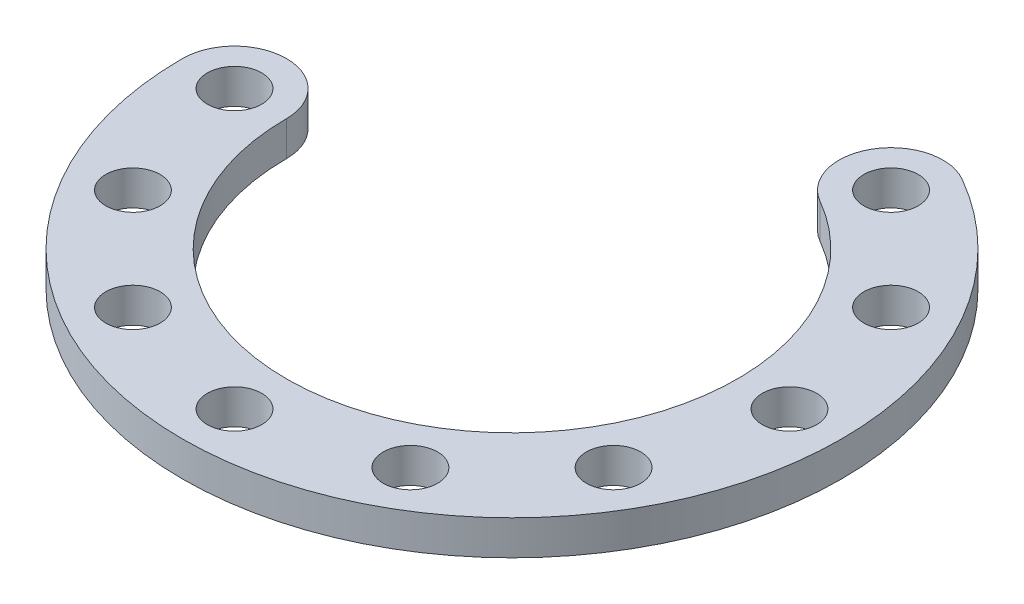
ISO-10303-21;
HEADER;
FILE_DESCRIPTION(('STEP AP214'),'2;1');
FILE_NAME('part.step','',(''),(''),'','','');
FILE_SCHEMA(('AUTOMOTIVE_DESIGN { 1 0 10303 214 1 1 1 1 }'));
ENDSEC;
DATA;
#1=APPLICATION_CONTEXT('core data for automotive mechanical design processes');
#2=APPLICATION_PROTOCOL_DEFINITION('international standard','automotive_design',2000,#1);
#3=PRODUCT_CONTEXT('',#1,'mechanical');
#4=PRODUCT('Part','Part','',(#3));
#5=PRODUCT_RELATED_PRODUCT_CATEGORY('part','',(#4));
#6=PRODUCT_DEFINITION_FORMATION('','',#4);
#7=PRODUCT_DEFINITION_CONTEXT('part definition',#1,'design');
#8=PRODUCT_DEFINITION('design','',#6,#7);
#9=PRODUCT_DEFINITION_SHAPE('','',#8);
#10=(LENGTH_UNIT() NAMED_UNIT(*) SI_UNIT(.MILLI.,.METRE.));
#11=(NAMED_UNIT(*) PLANE_ANGLE_UNIT() SI_UNIT($,.RADIAN.));
#12=(NAMED_UNIT(*) SI_UNIT($,.STERADIAN.) SOLID_ANGLE_UNIT());
#13=UNCERTAINTY_MEASURE_WITH_UNIT(LENGTH_MEASURE(1.E-05),#10,'distance_accuracy_value','');
#14=(GEOMETRIC_REPRESENTATION_CONTEXT(3) GLOBAL_UNCERTAINTY_ASSIGNED_CONTEXT((#13)) GLOBAL_UNIT_ASSIGNED_CONTEXT((#10,
#11,#12)) REPRESENTATION_CONTEXT('',''));
#15=CARTESIAN_POINT('',(0.,0.,0.));
#16=DIRECTION('',(0.,0.,1.));
#17=DIRECTION('',(1.,0.,0.));
#18=AXIS2_PLACEMENT_3D('',#15,#16,#17);
#19=CARTESIAN_POINT('',(-12.7,3.175,0.));
#20=DIRECTION('',(0.,1.,0.));
#21=DIRECTION('',(0.,0.,1.));
#22=AXIS2_PLACEMENT_3D('',#19,#20,#21);
#23=PLANE('',#22);
#24=CARTESIAN_POINT('',(12.7,3.175,-21.9970452561248));
#25=DIRECTION('',(0.,1.,0.));
#26=DIRECTION('',(0.,0.,1.));
#27=AXIS2_PLACEMENT_3D('',#24,#25,#26);
#28=CIRCLE('',#27,2.48920000002373);
#29=CARTESIAN_POINT('',(12.7,3.175,-19.507845256101));
#30=VERTEX_POINT('',#29);
#31=EDGE_CURVE('E186',#30,#30,#28,.T.);
#32=ORIENTED_EDGE('',*,*,#31,.F.);
#33=EDGE_LOOP('',(#32));
#34=FACE_BOUND('',#33,.T.);
#35=CARTESIAN_POINT('',(-21.9970452561247,3.175,12.7));
#36=DIRECTION('',(0.,1.,0.));
#37=DIRECTION('',(0.,0.,1.));
#38=AXIS2_PLACEMENT_3D('',#35,#36,#37);
#39=CIRCLE('',#38,2.48920000000163);
#40=CARTESIAN_POINT('',(-21.9970452561247,3.175,15.1892000000016));
#41=VERTEX_POINT('',#40);
#42=EDGE_CURVE('E170',#41,#41,#39,.T.);
#43=ORIENTED_EDGE('',*,*,#42,.F.);
#44=EDGE_LOOP('',(#43));
#45=FACE_BOUND('',#44,.T.);
#46=CARTESIAN_POINT('',(0.,3.175,25.4));
#47=DIRECTION('',(0.,1.,0.));
#48=DIRECTION('',(0.,0.,1.));
#49=AXIS2_PLACEMENT_3D('',#46,#47,#48);
#50=CIRCLE('',#49,2.48919999998384);
#51=CARTESIAN_POINT('',(0.,3.175,27.8891999999838));
#52=VERTEX_POINT('',#51);
#53=EDGE_CURVE('E154',#52,#52,#50,.T.);
#54=ORIENTED_EDGE('',*,*,#53,.F.);
#55=EDGE_LOOP('',(#54));
#56=FACE_BOUND('',#55,.T.);
#57=CARTESIAN_POINT('',(21.9970452561247,3.175,12.7));
#58=DIRECTION('',(0.,1.,0.));
#59=DIRECTION('',(0.,0.,1.));
#60=AXIS2_PLACEMENT_3D('',#57,#58,#59);
#61=CIRCLE('',#60,2.48919999998932);
#62=CARTESIAN_POINT('',(21.9970452561247,3.175,15.1891999999893));
#63=VERTEX_POINT('',#62);
#64=EDGE_CURVE('E138',#63,#63,#61,.T.);
#65=ORIENTED_EDGE('',*,*,#64,.F.);
#66=EDGE_LOOP('',(#65));
#67=FACE_BOUND('',#66,.T.);
#68=CARTESIAN_POINT('',(-25.4,3.175,0.));
#69=DIRECTION('',(0.,1.,0.));
#70=DIRECTION('',(0.,0.,1.));
#71=AXIS2_PLACEMENT_3D('',#68,#69,#70);
#72=CIRCLE('',#71,4.7625);
#73=CARTESIAN_POINT('',(-20.6375,3.175,0.));
#74=VERTEX_POINT('',#73);
#75=CARTESIAN_POINT('',(-30.1625,3.175,0.));
#76=VERTEX_POINT('',#75);
#77=EDGE_CURVE('E96',#74,#76,#72,.T.);
#78=ORIENTED_EDGE('',*,*,#77,.T.);
#79=CARTESIAN_POINT('',(0.,3.175,0.));
#80=DIRECTION('',(0.,1.,0.));
#81=DIRECTION('',(0.,0.,1.));
#82=AXIS2_PLACEMENT_3D('',#79,#80,#81);
#83=CIRCLE('',#82,30.1625);
#84=CARTESIAN_POINT('',(15.08125,3.175,-26.1214912416481));
#85=VERTEX_POINT('',#84);
#86=EDGE_CURVE('E91',#76,#85,#83,.T.);
#87=ORIENTED_EDGE('',*,*,#86,.T.);
#88=CARTESIAN_POINT('',(12.7,3.175,-21.9970452561248));
#89=DIRECTION('',(0.,1.,0.));
#90=DIRECTION('',(0.,0.,1.));
#91=AXIS2_PLACEMENT_3D('',#88,#89,#90);
#92=CIRCLE('',#91,4.7625);
#93=CARTESIAN_POINT('',(10.31875,3.175,-17.8725992706014));
#94=VERTEX_POINT('',#93);
#95=EDGE_CURVE('E94',#85,#94,#92,.T.);
#96=ORIENTED_EDGE('',*,*,#95,.T.);
#97=CARTESIAN_POINT('',(0.,3.175,0.));
#98=DIRECTION('',(0.,-1.,0.));
#99=DIRECTION('',(0.,0.,1.));
#100=AXIS2_PLACEMENT_3D('',#97,#98,#99);
#101=CIRCLE('',#100,20.6375);
#102=EDGE_CURVE('E61',#94,#74,#101,.T.);
#103=ORIENTED_EDGE('',*,*,#102,.T.);
#104=EDGE_LOOP('',(#78,#87,#96,#103));
#105=FACE_BOUND('',#104,.T.);
#106=CARTESIAN_POINT('',(25.4,3.175,0.));
#107=DIRECTION('',(0.,1.,0.));
#108=DIRECTION('',(0.,0.,1.));
#109=AXIS2_PLACEMENT_3D('',#106,#107,#108);
#110=CIRCLE('',#109,2.4892);
#111=CARTESIAN_POINT('',(25.4,3.175,2.4892));
#112=VERTEX_POINT('',#111);
#113=EDGE_CURVE('E116',#112,#112,#110,.T.);
#114=ORIENTED_EDGE('',*,*,#113,.F.);
#115=EDGE_LOOP('',(#114));
#116=FACE_BOUND('',#115,.T.);
#117=CARTESIAN_POINT('',(12.7,3.175,21.9970452561247));
#118=DIRECTION('',(0.,1.,0.));
#119=DIRECTION('',(0.,0.,1.));
#120=AXIS2_PLACEMENT_3D('',#117,#118,#119);
#121=CIRCLE('',#120,2.4891999999834);
#122=CARTESIAN_POINT('',(12.7,3.175,24.4862452561081));
#123=VERTEX_POINT('',#122);
#124=EDGE_CURVE('E146',#123,#123,#121,.T.);
#125=ORIENTED_EDGE('',*,*,#124,.F.);
#126=EDGE_LOOP('',(#125));
#127=FACE_BOUND('',#126,.T.);
#128=CARTESIAN_POINT('',(-12.7,3.175,21.9970452561247));
#129=DIRECTION('',(0.,1.,0.));
#130=DIRECTION('',(0.,0.,1.));
#131=AXIS2_PLACEMENT_3D('',#128,#129,#130);
#132=CIRCLE('',#131,2.48919999999052);
#133=CARTESIAN_POINT('',(-12.7,3.175,24.4862452561153));
#134=VERTEX_POINT('',#133);
#135=EDGE_CURVE('E162',#134,#134,#132,.T.);
#136=ORIENTED_EDGE('',*,*,#135,.F.);
#137=EDGE_LOOP('',(#136));
#138=FACE_BOUND('',#137,.T.);
#139=CARTESIAN_POINT('',(-25.4,3.175,0.));
#140=DIRECTION('',(0.,1.,0.));
#141=DIRECTION('',(0.,0.,1.));
#142=AXIS2_PLACEMENT_3D('',#139,#140,#141);
#143=CIRCLE('',#142,2.48920000001423);
#144=CARTESIAN_POINT('',(-25.4,3.175,2.48920000001423));
#145=VERTEX_POINT('',#144);
#146=EDGE_CURVE('E178',#145,#145,#143,.T.);
#147=ORIENTED_EDGE('',*,*,#146,.F.);
#148=EDGE_LOOP('',(#147));
#149=FACE_BOUND('',#148,.T.);
#150=CARTESIAN_POINT('',(21.9970452561247,3.175,-12.7));
#151=DIRECTION('',(0.,1.,0.));
#152=DIRECTION('',(0.,0.,1.));
#153=AXIS2_PLACEMENT_3D('',#150,#151,#152);
#154=CIRCLE('',#153,2.4892000000126);
#155=CARTESIAN_POINT('',(21.9970452561247,3.175,-10.2107999999874));
#156=VERTEX_POINT('',#155);
#157=EDGE_CURVE('E194',#156,#156,#154,.T.);
#158=ORIENTED_EDGE('',*,*,#157,.F.);
#159=EDGE_LOOP('',(#158));
#160=FACE_BOUND('',#159,.T.);
#161=ADVANCED_FACE('F43',(#34,#45,#56,#67,#105,#116,#127,#138,#149,#160),#23,.T.);
#162=CARTESIAN_POINT('',(-12.7,0.,0.));
#163=DIRECTION('',(0.,1.,0.));
#164=DIRECTION('',(0.,0.,1.));
#165=AXIS2_PLACEMENT_3D('',#162,#163,#164);
#166=PLANE('',#165);
#167=CARTESIAN_POINT('',(-25.4,0.,0.));
#168=DIRECTION('',(0.,1.,0.));
#169=DIRECTION('',(0.,0.,1.));
#170=AXIS2_PLACEMENT_3D('',#167,#168,#169);
#171=CIRCLE('',#170,4.7625);
#172=CARTESIAN_POINT('',(-20.6375,0.,0.));
#173=VERTEX_POINT('',#172);
#174=CARTESIAN_POINT('',(-30.1625,0.,0.));
#175=VERTEX_POINT('',#174);
#176=EDGE_CURVE('E112',#173,#175,#171,.T.);
#177=ORIENTED_EDGE('',*,*,#176,.F.);
#178=CARTESIAN_POINT('',(0.,0.,0.));
#179=DIRECTION('',(0.,-1.,0.));
#180=DIRECTION('',(0.,0.,1.));
#181=AXIS2_PLACEMENT_3D('',#178,#179,#180);
#182=CIRCLE('',#181,20.6375);
#183=CARTESIAN_POINT('',(10.31875,0.,-17.8725992706014));
#184=VERTEX_POINT('',#183);
#185=EDGE_CURVE('E84',#184,#173,#182,.T.);
#186=ORIENTED_EDGE('',*,*,#185,.F.);
#187=CARTESIAN_POINT('',(12.7,0.,-21.9970452561248));
#188=DIRECTION('',(0.,1.,0.));
#189=DIRECTION('',(0.,0.,1.));
#190=AXIS2_PLACEMENT_3D('',#187,#188,#189);
#191=CIRCLE('',#190,4.7625);
#192=CARTESIAN_POINT('',(15.08125,0.,-26.1214912416481));
#193=VERTEX_POINT('',#192);
#194=EDGE_CURVE('E78',#193,#184,#191,.T.);
#195=ORIENTED_EDGE('',*,*,#194,.F.);
#196=CARTESIAN_POINT('',(0.,0.,0.));
#197=DIRECTION('',(0.,1.,0.));
#198=DIRECTION('',(0.,0.,1.));
#199=AXIS2_PLACEMENT_3D('',#196,#197,#198);
#200=CIRCLE('',#199,30.1625);
#201=EDGE_CURVE('E101',#175,#193,#200,.T.);
#202=ORIENTED_EDGE('',*,*,#201,.F.);
#203=EDGE_LOOP('',(#177,#186,#195,#202));
#204=FACE_BOUND('',#203,.T.);
#205=CARTESIAN_POINT('',(25.4,0.,0.));
#206=DIRECTION('',(0.,1.,0.));
#207=DIRECTION('',(0.,0.,1.));
#208=AXIS2_PLACEMENT_3D('',#205,#206,#207);
#209=CIRCLE('',#208,2.4892);
#210=CARTESIAN_POINT('',(25.4,0.,2.4892));
#211=VERTEX_POINT('',#210);
#212=EDGE_CURVE('E134',#211,#211,#209,.T.);
#213=ORIENTED_EDGE('',*,*,#212,.T.);
#214=EDGE_LOOP('',(#213));
#215=FACE_BOUND('',#214,.T.);
#216=CARTESIAN_POINT('',(21.9970452561247,0.,12.7));
#217=DIRECTION('',(0.,1.,0.));
#218=DIRECTION('',(0.,0.,1.));
#219=AXIS2_PLACEMENT_3D('',#216,#217,#218);
#220=CIRCLE('',#219,2.48919999998932);
#221=CARTESIAN_POINT('',(21.9970452561247,0.,15.1891999999893));
#222=VERTEX_POINT('',#221);
#223=EDGE_CURVE('E142',#222,#222,#220,.T.);
#224=ORIENTED_EDGE('',*,*,#223,.T.);
#225=EDGE_LOOP('',(#224));
#226=FACE_BOUND('',#225,.T.);
#227=CARTESIAN_POINT('',(12.7,0.,21.9970452561247));
#228=DIRECTION('',(0.,1.,0.));
#229=DIRECTION('',(0.,0.,1.));
#230=AXIS2_PLACEMENT_3D('',#227,#228,#229);
#231=CIRCLE('',#230,2.4891999999834);
#232=CARTESIAN_POINT('',(12.7,0.,24.4862452561081));
#233=VERTEX_POINT('',#232);
#234=EDGE_CURVE('E150',#233,#233,#231,.T.);
#235=ORIENTED_EDGE('',*,*,#234,.T.);
#236=EDGE_LOOP('',(#235));
#237=FACE_BOUND('',#236,.T.);
#238=CARTESIAN_POINT('',(0.,0.,25.4));
#239=DIRECTION('',(0.,1.,0.));
#240=DIRECTION('',(0.,0.,1.));
#241=AXIS2_PLACEMENT_3D('',#238,#239,#240);
#242=CIRCLE('',#241,2.48919999998384);
#243=CARTESIAN_POINT('',(0.,0.,27.8891999999838));
#244=VERTEX_POINT('',#243);
#245=EDGE_CURVE('E158',#244,#244,#242,.T.);
#246=ORIENTED_EDGE('',*,*,#245,.T.);
#247=EDGE_LOOP('',(#246));
#248=FACE_BOUND('',#247,.T.);
#249=CARTESIAN_POINT('',(-12.7,0.,21.9970452561247));
#250=DIRECTION('',(0.,1.,0.));
#251=DIRECTION('',(0.,0.,1.));
#252=AXIS2_PLACEMENT_3D('',#249,#250,#251);
#253=CIRCLE('',#252,2.48919999999052);
#254=CARTESIAN_POINT('',(-12.7,0.,24.4862452561153));
#255=VERTEX_POINT('',#254);
#256=EDGE_CURVE('E166',#255,#255,#253,.T.);
#257=ORIENTED_EDGE('',*,*,#256,.T.);
#258=EDGE_LOOP('',(#257));
#259=FACE_BOUND('',#258,.T.);
#260=CARTESIAN_POINT('',(-21.9970452561247,0.,12.7));
#261=DIRECTION('',(0.,1.,0.));
#262=DIRECTION('',(0.,0.,1.));
#263=AXIS2_PLACEMENT_3D('',#260,#261,#262);
#264=CIRCLE('',#263,2.48920000000163);
#265=CARTESIAN_POINT('',(-21.9970452561247,0.,15.1892000000016));
#266=VERTEX_POINT('',#265);
#267=EDGE_CURVE('E174',#266,#266,#264,.T.);
#268=ORIENTED_EDGE('',*,*,#267,.T.);
#269=EDGE_LOOP('',(#268));
#270=FACE_BOUND('',#269,.T.);
#271=CARTESIAN_POINT('',(-25.4,0.,0.));
#272=DIRECTION('',(0.,1.,0.));
#273=DIRECTION('',(0.,0.,1.));
#274=AXIS2_PLACEMENT_3D('',#271,#272,#273);
#275=CIRCLE('',#274,2.48920000001423);
#276=CARTESIAN_POINT('',(-25.4,0.,2.48920000001423));
#277=VERTEX_POINT('',#276);
#278=EDGE_CURVE('E182',#277,#277,#275,.T.);
#279=ORIENTED_EDGE('',*,*,#278,.T.);
#280=EDGE_LOOP('',(#279));
#281=FACE_BOUND('',#280,.T.);
#282=CARTESIAN_POINT('',(12.7,0.,-21.9970452561248));
#283=DIRECTION('',(0.,1.,0.));
#284=DIRECTION('',(0.,0.,1.));
#285=AXIS2_PLACEMENT_3D('',#282,#283,#284);
#286=CIRCLE('',#285,2.48920000002373);
#287=CARTESIAN_POINT('',(12.7,0.,-19.507845256101));
#288=VERTEX_POINT('',#287);
#289=EDGE_CURVE('E190',#288,#288,#286,.T.);
#290=ORIENTED_EDGE('',*,*,#289,.T.);
#291=EDGE_LOOP('',(#290));
#292=FACE_BOUND('',#291,.T.);
#293=CARTESIAN_POINT('',(21.9970452561247,0.,-12.7));
#294=DIRECTION('',(0.,1.,0.));
#295=DIRECTION('',(0.,0.,1.));
#296=AXIS2_PLACEMENT_3D('',#293,#294,#295);
#297=CIRCLE('',#296,2.4892000000126);
#298=CARTESIAN_POINT('',(21.9970452561247,0.,-10.2107999999874));
#299=VERTEX_POINT('',#298);
#300=EDGE_CURVE('E198',#299,#299,#297,.T.);
#301=ORIENTED_EDGE('',*,*,#300,.T.);
#302=EDGE_LOOP('',(#301));
#303=FACE_BOUND('',#302,.T.);
#304=ADVANCED_FACE('F129',(#204,#215,#226,#237,#248,#259,#270,#281,#292,#303),#166,.F.);
#305=CARTESIAN_POINT('',(-25.4,3.175,0.));
#306=DIRECTION('',(0.,-1.,0.));
#307=DIRECTION('',(0.,0.,-1.));
#308=AXIS2_PLACEMENT_3D('',#305,#306,#307);
#309=CYLINDRICAL_SURFACE('',#308,4.7625);
#310=ORIENTED_EDGE('',*,*,#176,.T.);
#311=DIRECTION('',(0.,-1.,0.));
#312=VECTOR('',#311,1.);
#313=CARTESIAN_POINT('',(-30.1625,3.175,0.));
#314=LINE('',#313,#312);
#315=EDGE_CURVE('E11',#76,#175,#314,.T.);
#316=ORIENTED_EDGE('',*,*,#315,.F.);
#317=ORIENTED_EDGE('',*,*,#77,.F.);
#318=DIRECTION('',(0.,-1.,0.));
#319=VECTOR('',#318,1.);
#320=CARTESIAN_POINT('',(-20.6375,3.175,0.));
#321=LINE('',#320,#319);
#322=EDGE_CURVE('E108',#74,#173,#321,.T.);
#323=ORIENTED_EDGE('',*,*,#322,.T.);
#324=EDGE_LOOP('',(#310,#316,#317,#323));
#325=FACE_BOUND('',#324,.T.);
#326=ADVANCED_FACE('F45',(#325),#309,.T.);
#327=CARTESIAN_POINT('',(0.,3.175,0.));
#328=DIRECTION('',(0.,-1.,0.));
#329=DIRECTION('',(0.,0.,-1.));
#330=AXIS2_PLACEMENT_3D('',#327,#328,#329);
#331=CYLINDRICAL_SURFACE('',#330,30.1625);
#332=ORIENTED_EDGE('',*,*,#201,.T.);
#333=DIRECTION('',(0.,-1.,0.));
#334=VECTOR('',#333,1.);
#335=CARTESIAN_POINT('',(15.08125,3.175,-26.1214912416481));
#336=LINE('',#335,#334);
#337=EDGE_CURVE('E53',#85,#193,#336,.T.);
#338=ORIENTED_EDGE('',*,*,#337,.F.);
#339=ORIENTED_EDGE('',*,*,#86,.F.);
#340=ORIENTED_EDGE('',*,*,#315,.T.);
#341=EDGE_LOOP('',(#332,#338,#339,#340));
#342=FACE_BOUND('',#341,.T.);
#343=ADVANCED_FACE('F100',(#342),#331,.T.);
#344=CARTESIAN_POINT('',(12.7,3.175,-21.9970452561248));
#345=DIRECTION('',(0.,-1.,0.));
#346=DIRECTION('',(0.,0.,-1.));
#347=AXIS2_PLACEMENT_3D('',#344,#345,#346);
#348=CYLINDRICAL_SURFACE('',#347,4.7625);
#349=ORIENTED_EDGE('',*,*,#194,.T.);
#350=DIRECTION('',(0.,-1.,0.));
#351=VECTOR('',#350,1.);
#352=CARTESIAN_POINT('',(10.31875,3.175,-17.8725992706014));
#353=LINE('',#352,#351);
#354=EDGE_CURVE('E103',#94,#184,#353,.T.);
#355=ORIENTED_EDGE('',*,*,#354,.F.);
#356=ORIENTED_EDGE('',*,*,#95,.F.);
#357=ORIENTED_EDGE('',*,*,#337,.T.);
#358=EDGE_LOOP('',(#349,#355,#356,#357));
#359=FACE_BOUND('',#358,.T.);
#360=ADVANCED_FACE('F104',(#359),#348,.T.);
#361=CARTESIAN_POINT('',(0.,3.175,0.));
#362=DIRECTION('',(0.,-1.,0.));
#363=DIRECTION('',(0.,0.,-1.));
#364=AXIS2_PLACEMENT_3D('',#361,#362,#363);
#365=CYLINDRICAL_SURFACE('',#364,20.6375);
#366=ORIENTED_EDGE('',*,*,#185,.T.);
#367=ORIENTED_EDGE('',*,*,#322,.F.);
#368=ORIENTED_EDGE('',*,*,#102,.F.);
#369=ORIENTED_EDGE('',*,*,#354,.T.);
#370=EDGE_LOOP('',(#366,#367,#368,#369));
#371=FACE_BOUND('',#370,.T.);
#372=ADVANCED_FACE('F126',(#371),#365,.F.);
#373=CARTESIAN_POINT('',(25.4,3.175,0.));
#374=DIRECTION('',(0.,-1.,0.));
#375=DIRECTION('',(0.,0.,-1.));
#376=AXIS2_PLACEMENT_3D('',#373,#374,#375);
#377=CYLINDRICAL_SURFACE('',#376,2.4892);
#378=ORIENTED_EDGE('',*,*,#113,.T.);
#379=EDGE_LOOP('',(#378));
#380=FACE_BOUND('',#379,.T.);
#381=ORIENTED_EDGE('',*,*,#212,.F.);
#382=EDGE_LOOP('',(#381));
#383=FACE_BOUND('',#382,.T.);
#384=ADVANCED_FACE('F219',(#380,#383),#377,.F.);
#385=CARTESIAN_POINT('',(21.9970452561247,3.175,12.7));
#386=DIRECTION('',(0.,-1.,0.));
#387=DIRECTION('',(0.,0.,-1.));
#388=AXIS2_PLACEMENT_3D('',#385,#386,#387);
#389=CYLINDRICAL_SURFACE('',#388,2.48919999998932);
#390=ORIENTED_EDGE('',*,*,#64,.T.);
#391=EDGE_LOOP('',(#390));
#392=FACE_BOUND('',#391,.T.);
#393=ORIENTED_EDGE('',*,*,#223,.F.);
#394=EDGE_LOOP('',(#393));
#395=FACE_BOUND('',#394,.T.);
#396=ADVANCED_FACE('F273',(#392,#395),#389,.F.);
#397=CARTESIAN_POINT('',(12.7,3.175,21.9970452561247));
#398=DIRECTION('',(0.,-1.,0.));
#399=DIRECTION('',(0.,0.,-1.));
#400=AXIS2_PLACEMENT_3D('',#397,#398,#399);
#401=CYLINDRICAL_SURFACE('',#400,2.4891999999834);
#402=ORIENTED_EDGE('',*,*,#124,.T.);
#403=EDGE_LOOP('',(#402));
#404=FACE_BOUND('',#403,.T.);
#405=ORIENTED_EDGE('',*,*,#234,.F.);
#406=EDGE_LOOP('',(#405));
#407=FACE_BOUND('',#406,.T.);
#408=ADVANCED_FACE('F282',(#404,#407),#401,.F.);
#409=CARTESIAN_POINT('',(0.,3.175,25.4));
#410=DIRECTION('',(0.,-1.,0.));
#411=DIRECTION('',(0.,0.,-1.));
#412=AXIS2_PLACEMENT_3D('',#409,#410,#411);
#413=CYLINDRICAL_SURFACE('',#412,2.48919999998384);
#414=ORIENTED_EDGE('',*,*,#53,.T.);
#415=EDGE_LOOP('',(#414));
#416=FACE_BOUND('',#415,.T.);
#417=ORIENTED_EDGE('',*,*,#245,.F.);
#418=EDGE_LOOP('',(#417));
#419=FACE_BOUND('',#418,.T.);
#420=ADVANCED_FACE('F291',(#416,#419),#413,.F.);
#421=CARTESIAN_POINT('',(-12.7,3.175,21.9970452561247));
#422=DIRECTION('',(0.,-1.,0.));
#423=DIRECTION('',(0.,0.,-1.));
#424=AXIS2_PLACEMENT_3D('',#421,#422,#423);
#425=CYLINDRICAL_SURFACE('',#424,2.48919999999052);
#426=ORIENTED_EDGE('',*,*,#135,.T.);
#427=EDGE_LOOP('',(#426));
#428=FACE_BOUND('',#427,.T.);
#429=ORIENTED_EDGE('',*,*,#256,.F.);
#430=EDGE_LOOP('',(#429));
#431=FACE_BOUND('',#430,.T.);
#432=ADVANCED_FACE('F301',(#428,#431),#425,.F.);
#433=CARTESIAN_POINT('',(-21.9970452561247,3.175,12.7));
#434=DIRECTION('',(0.,-1.,0.));
#435=DIRECTION('',(0.,0.,-1.));
#436=AXIS2_PLACEMENT_3D('',#433,#434,#435);
#437=CYLINDRICAL_SURFACE('',#436,2.48920000000163);
#438=ORIENTED_EDGE('',*,*,#42,.T.);
#439=EDGE_LOOP('',(#438));
#440=FACE_BOUND('',#439,.T.);
#441=ORIENTED_EDGE('',*,*,#267,.F.);
#442=EDGE_LOOP('',(#441));
#443=FACE_BOUND('',#442,.T.);
#444=ADVANCED_FACE('F311',(#440,#443),#437,.F.);
#445=CARTESIAN_POINT('',(-25.4,3.175,0.));
#446=DIRECTION('',(0.,-1.,0.));
#447=DIRECTION('',(0.,0.,-1.));
#448=AXIS2_PLACEMENT_3D('',#445,#446,#447);
#449=CYLINDRICAL_SURFACE('',#448,2.48920000001423);
#450=ORIENTED_EDGE('',*,*,#146,.T.);
#451=EDGE_LOOP('',(#450));
#452=FACE_BOUND('',#451,.T.);
#453=ORIENTED_EDGE('',*,*,#278,.F.);
#454=EDGE_LOOP('',(#453));
#455=FACE_BOUND('',#454,.T.);
#456=ADVANCED_FACE('F321',(#452,#455),#449,.F.);
#457=CARTESIAN_POINT('',(12.7,3.175,-21.9970452561248));
#458=DIRECTION('',(0.,-1.,0.));
#459=DIRECTION('',(0.,0.,-1.));
#460=AXIS2_PLACEMENT_3D('',#457,#458,#459);
#461=CYLINDRICAL_SURFACE('',#460,2.48920000002373);
#462=ORIENTED_EDGE('',*,*,#31,.T.);
#463=EDGE_LOOP('',(#462));
#464=FACE_BOUND('',#463,.T.);
#465=ORIENTED_EDGE('',*,*,#289,.F.);
#466=EDGE_LOOP('',(#465));
#467=FACE_BOUND('',#466,.T.);
#468=ADVANCED_FACE('F331',(#464,#467),#461,.F.);
#469=CARTESIAN_POINT('',(21.9970452561247,3.175,-12.7));
#470=DIRECTION('',(0.,-1.,0.));
#471=DIRECTION('',(0.,0.,-1.));
#472=AXIS2_PLACEMENT_3D('',#469,#470,#471);
#473=CYLINDRICAL_SURFACE('',#472,2.4892000000126);
#474=ORIENTED_EDGE('',*,*,#157,.T.);
#475=EDGE_LOOP('',(#474));
#476=FACE_BOUND('',#475,.T.);
#477=ORIENTED_EDGE('',*,*,#300,.F.);
#478=EDGE_LOOP('',(#477));
#479=FACE_BOUND('',#478,.T.);
#480=ADVANCED_FACE('F206',(#476,#479),#473,.F.);
#481=CLOSED_SHELL('',(#161,#304,#326,#343,#360,#372,#384,#396,#408,#420,#432,#444,#456,#468,#480));
#482=MANIFOLD_SOLID_BREP('B2',#481);
#483=ADVANCED_BREP_SHAPE_REPRESENTATION('',(#18,#482),#14);
#484=SHAPE_DEFINITION_REPRESENTATION(#9,#483);
ENDSEC;
END-ISO-10303-21;
